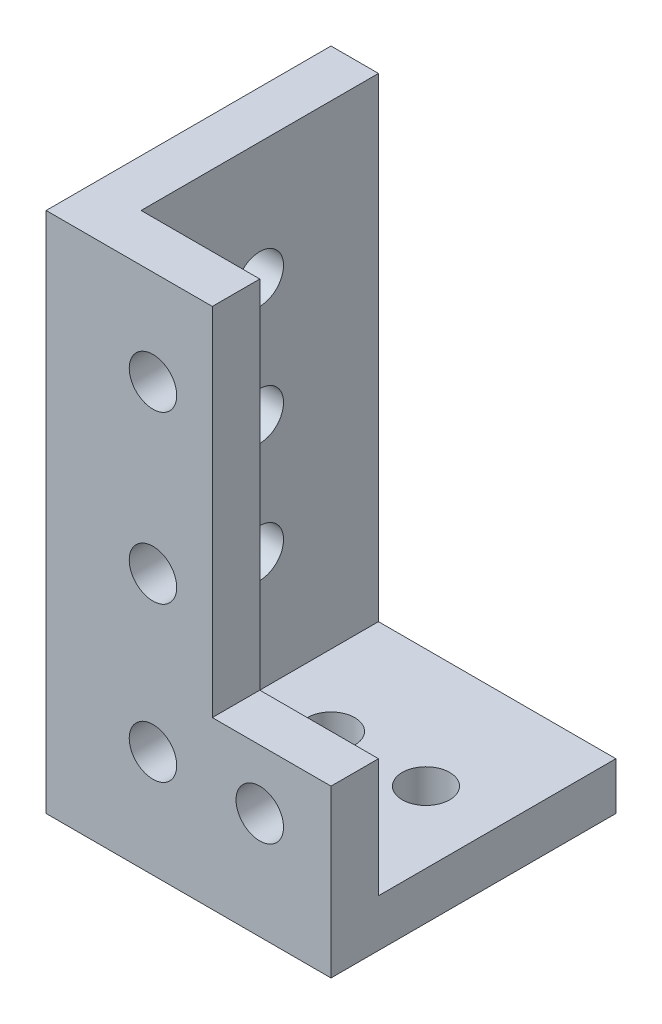
ISO-10303-21;
HEADER;
FILE_DESCRIPTION(('STEP AP214'),'2;1');
FILE_NAME('part.step','',(''),(''),'','','');
FILE_SCHEMA(('AUTOMOTIVE_DESIGN { 1 0 10303 214 1 1 1 1 }'));
ENDSEC;
DATA;
#1=APPLICATION_CONTEXT('core data for automotive mechanical design processes');
#2=APPLICATION_PROTOCOL_DEFINITION('international standard','automotive_design',2000,#1);
#3=PRODUCT_CONTEXT('',#1,'mechanical');
#4=PRODUCT('Part','Part','',(#3));
#5=PRODUCT_RELATED_PRODUCT_CATEGORY('part','',(#4));
#6=PRODUCT_DEFINITION_FORMATION('','',#4);
#7=PRODUCT_DEFINITION_CONTEXT('part definition',#1,'design');
#8=PRODUCT_DEFINITION('design','',#6,#7);
#9=PRODUCT_DEFINITION_SHAPE('','',#8);
#10=(LENGTH_UNIT() NAMED_UNIT(*) SI_UNIT(.MILLI.,.METRE.));
#11=(NAMED_UNIT(*) PLANE_ANGLE_UNIT() SI_UNIT($,.RADIAN.));
#12=(NAMED_UNIT(*) SI_UNIT($,.STERADIAN.) SOLID_ANGLE_UNIT());
#13=UNCERTAINTY_MEASURE_WITH_UNIT(LENGTH_MEASURE(1.E-05),#10,'distance_accuracy_value','');
#14=(GEOMETRIC_REPRESENTATION_CONTEXT(3) GLOBAL_UNCERTAINTY_ASSIGNED_CONTEXT((#13)) GLOBAL_UNIT_ASSIGNED_CONTEXT((#10,
#11,#12)) REPRESENTATION_CONTEXT('',''));
#15=CARTESIAN_POINT('',(0.,0.,0.));
#16=DIRECTION('',(0.,0.,1.));
#17=DIRECTION('',(1.,0.,0.));
#18=AXIS2_PLACEMENT_3D('',#15,#16,#17);
#19=CARTESIAN_POINT('',(0.,0.,50.));
#20=DIRECTION('',(1.,0.,0.));
#21=DIRECTION('',(0.,0.,-1.));
#22=AXIS2_PLACEMENT_3D('',#19,#20,#21);
#23=PLANE('',#22);
#24=CARTESIAN_POINT('',(0.,35.,25.));
#25=DIRECTION('',(1.,0.,0.));
#26=DIRECTION('',(0.,0.,-1.));
#27=AXIS2_PLACEMENT_3D('',#24,#25,#26);
#28=CIRCLE('',#27,5.);
#29=CARTESIAN_POINT('',(0.,35.,20.));
#30=VERTEX_POINT('',#29);
#31=EDGE_CURVE('E235',#30,#30,#28,.T.);
#32=ORIENTED_EDGE('',*,*,#31,.T.);
#33=EDGE_LOOP('',(#32));
#34=FACE_BOUND('',#33,.T.);
#35=CARTESIAN_POINT('',(0.,85.,25.));
#36=DIRECTION('',(1.,0.,0.));
#37=DIRECTION('',(0.,0.,-1.));
#38=AXIS2_PLACEMENT_3D('',#35,#36,#37);
#39=CIRCLE('',#38,5.);
#40=CARTESIAN_POINT('',(0.,85.,20.));
#41=VERTEX_POINT('',#40);
#42=EDGE_CURVE('E239',#41,#41,#39,.T.);
#43=ORIENTED_EDGE('',*,*,#42,.T.);
#44=EDGE_LOOP('',(#43));
#45=FACE_BOUND('',#44,.T.);
#46=CARTESIAN_POINT('',(0.,60.,25.));
#47=DIRECTION('',(1.,0.,0.));
#48=DIRECTION('',(0.,0.,-1.));
#49=AXIS2_PLACEMENT_3D('',#46,#47,#48);
#50=CIRCLE('',#49,5.);
#51=CARTESIAN_POINT('',(0.,60.,20.));
#52=VERTEX_POINT('',#51);
#53=EDGE_CURVE('E179',#52,#52,#50,.T.);
#54=ORIENTED_EDGE('',*,*,#53,.T.);
#55=EDGE_LOOP('',(#54));
#56=FACE_BOUND('',#55,.T.);
#57=DIRECTION('',(0.,-1.,0.));
#58=VECTOR('',#57,1.);
#59=CARTESIAN_POINT('',(0.,0.,0.));
#60=LINE('',#59,#58);
#61=CARTESIAN_POINT('',(0.,110.,0.));
#62=VERTEX_POINT('',#61);
#63=CARTESIAN_POINT('',(0.,0.,0.));
#64=VERTEX_POINT('',#63);
#65=EDGE_CURVE('E96',#62,#64,#60,.T.);
#66=ORIENTED_EDGE('',*,*,#65,.T.);
#67=DIRECTION('',(0.,0.,-1.));
#68=VECTOR('',#67,1.);
#69=CARTESIAN_POINT('',(0.,0.,50.));
#70=LINE('',#69,#68);
#71=CARTESIAN_POINT('',(0.,0.,60.));
#72=VERTEX_POINT('',#71);
#73=EDGE_CURVE('E11',#72,#64,#70,.T.);
#74=ORIENTED_EDGE('',*,*,#73,.F.);
#75=DIRECTION('',(0.,-1.,0.));
#76=VECTOR('',#75,1.);
#77=CARTESIAN_POINT('',(0.,0.,60.));
#78=LINE('',#77,#76);
#79=CARTESIAN_POINT('',(0.,110.,60.));
#80=VERTEX_POINT('',#79);
#81=EDGE_CURVE('E98',#80,#72,#78,.T.);
#82=ORIENTED_EDGE('',*,*,#81,.F.);
#83=DIRECTION('',(0.,0.,-1.));
#84=VECTOR('',#83,1.);
#85=CARTESIAN_POINT('',(0.,110.,50.));
#86=LINE('',#85,#84);
#87=EDGE_CURVE('E84',#80,#62,#86,.T.);
#88=ORIENTED_EDGE('',*,*,#87,.T.);
#89=EDGE_LOOP('',(#66,#74,#82,#88));
#90=FACE_BOUND('',#89,.T.);
#91=ADVANCED_FACE('F33',(#34,#45,#56,#90),#23,.F.);
#92=CARTESIAN_POINT('',(0.,0.,50.));
#93=DIRECTION('',(0.,1.,0.));
#94=DIRECTION('',(0.,0.,1.));
#95=AXIS2_PLACEMENT_3D('',#92,#93,#94);
#96=PLANE('',#95);
#97=CARTESIAN_POINT('',(25.,0.,25.));
#98=DIRECTION('',(0.,1.,0.));
#99=DIRECTION('',(0.,0.,1.));
#100=AXIS2_PLACEMENT_3D('',#97,#98,#99);
#101=CIRCLE('',#100,5.);
#102=CARTESIAN_POINT('',(25.,0.,30.));
#103=VERTEX_POINT('',#102);
#104=EDGE_CURVE('E259',#103,#103,#101,.T.);
#105=ORIENTED_EDGE('',*,*,#104,.T.);
#106=EDGE_LOOP('',(#105));
#107=FACE_BOUND('',#106,.T.);
#108=CARTESIAN_POINT('',(45.,0.,25.));
#109=DIRECTION('',(0.,1.,0.));
#110=DIRECTION('',(0.,0.,1.));
#111=AXIS2_PLACEMENT_3D('',#108,#109,#110);
#112=CIRCLE('',#111,5.);
#113=CARTESIAN_POINT('',(45.,0.,30.));
#114=VERTEX_POINT('',#113);
#115=EDGE_CURVE('E254',#114,#114,#112,.T.);
#116=ORIENTED_EDGE('',*,*,#115,.T.);
#117=EDGE_LOOP('',(#116));
#118=FACE_BOUND('',#117,.T.);
#119=DIRECTION('',(1.,0.,0.));
#120=VECTOR('',#119,1.);
#121=CARTESIAN_POINT('',(0.,0.,0.));
#122=LINE('',#121,#120);
#123=CARTESIAN_POINT('',(60.,0.,0.));
#124=VERTEX_POINT('',#123);
#125=EDGE_CURVE('E103',#64,#124,#122,.T.);
#126=ORIENTED_EDGE('',*,*,#125,.T.);
#127=DIRECTION('',(0.,0.,-1.));
#128=VECTOR('',#127,1.);
#129=CARTESIAN_POINT('',(60.,0.,50.));
#130=LINE('',#129,#128);
#131=CARTESIAN_POINT('',(60.,0.,60.));
#132=VERTEX_POINT('',#131);
#133=EDGE_CURVE('E42',#132,#124,#130,.T.);
#134=ORIENTED_EDGE('',*,*,#133,.F.);
#135=DIRECTION('',(1.,0.,0.));
#136=VECTOR('',#135,1.);
#137=CARTESIAN_POINT('',(60.,0.,60.));
#138=LINE('',#137,#136);
#139=EDGE_CURVE('E154',#72,#132,#138,.T.);
#140=ORIENTED_EDGE('',*,*,#139,.F.);
#141=ORIENTED_EDGE('',*,*,#73,.T.);
#142=EDGE_LOOP('',(#126,#134,#140,#141));
#143=FACE_BOUND('',#142,.T.);
#144=ADVANCED_FACE('F152',(#107,#118,#143),#96,.F.);
#145=CARTESIAN_POINT('',(60.,10.,50.));
#146=DIRECTION('',(-1.,0.,0.));
#147=DIRECTION('',(0.,0.,1.));
#148=AXIS2_PLACEMENT_3D('',#145,#146,#147);
#149=PLANE('',#148);
#150=DIRECTION('',(0.,1.,0.));
#151=VECTOR('',#150,1.);
#152=CARTESIAN_POINT('',(60.,10.,0.));
#153=LINE('',#152,#151);
#154=CARTESIAN_POINT('',(60.,10.,0.));
#155=VERTEX_POINT('',#154);
#156=EDGE_CURVE('E106',#124,#155,#153,.T.);
#157=ORIENTED_EDGE('',*,*,#156,.T.);
#158=DIRECTION('',(0.,0.,-1.));
#159=VECTOR('',#158,1.);
#160=CARTESIAN_POINT('',(60.,10.,50.));
#161=LINE('',#160,#159);
#162=CARTESIAN_POINT('',(60.,10.,50.));
#163=VERTEX_POINT('',#162);
#164=EDGE_CURVE('E120',#163,#155,#161,.T.);
#165=ORIENTED_EDGE('',*,*,#164,.F.);
#166=DIRECTION('',(0.,1.,0.));
#167=VECTOR('',#166,1.);
#168=CARTESIAN_POINT('',(60.,35.,50.));
#169=LINE('',#168,#167);
#170=CARTESIAN_POINT('',(60.,35.,50.));
#171=VERTEX_POINT('',#170);
#172=EDGE_CURVE('E138',#163,#171,#169,.T.);
#173=ORIENTED_EDGE('',*,*,#172,.T.);
#174=DIRECTION('',(0.,0.,-1.));
#175=VECTOR('',#174,1.);
#176=CARTESIAN_POINT('',(60.,35.,60.));
#177=LINE('',#176,#175);
#178=CARTESIAN_POINT('',(60.,35.,60.));
#179=VERTEX_POINT('',#178);
#180=EDGE_CURVE('E104',#179,#171,#177,.T.);
#181=ORIENTED_EDGE('',*,*,#180,.F.);
#182=DIRECTION('',(0.,1.,0.));
#183=VECTOR('',#182,1.);
#184=CARTESIAN_POINT('',(60.,35.,60.));
#185=LINE('',#184,#183);
#186=EDGE_CURVE('E148',#132,#179,#185,.T.);
#187=ORIENTED_EDGE('',*,*,#186,.F.);
#188=ORIENTED_EDGE('',*,*,#133,.T.);
#189=EDGE_LOOP('',(#157,#165,#173,#181,#187,#188));
#190=FACE_BOUND('',#189,.T.);
#191=ADVANCED_FACE('F142',(#190),#149,.F.);
#192=CARTESIAN_POINT('',(10.,10.,50.));
#193=DIRECTION('',(0.,-1.,0.));
#194=DIRECTION('',(0.,0.,-1.));
#195=AXIS2_PLACEMENT_3D('',#192,#193,#194);
#196=PLANE('',#195);
#197=CARTESIAN_POINT('',(25.,10.,25.));
#198=DIRECTION('',(0.,1.,0.));
#199=DIRECTION('',(0.,0.,1.));
#200=AXIS2_PLACEMENT_3D('',#197,#198,#199);
#201=CIRCLE('',#200,5.);
#202=CARTESIAN_POINT('',(25.,10.,30.));
#203=VERTEX_POINT('',#202);
#204=EDGE_CURVE('E262',#203,#203,#201,.T.);
#205=ORIENTED_EDGE('',*,*,#204,.F.);
#206=EDGE_LOOP('',(#205));
#207=FACE_BOUND('',#206,.T.);
#208=CARTESIAN_POINT('',(45.,10.,25.));
#209=DIRECTION('',(0.,1.,0.));
#210=DIRECTION('',(0.,0.,1.));
#211=AXIS2_PLACEMENT_3D('',#208,#209,#210);
#212=CIRCLE('',#211,5.);
#213=CARTESIAN_POINT('',(45.,10.,30.));
#214=VERTEX_POINT('',#213);
#215=EDGE_CURVE('E256',#214,#214,#212,.T.);
#216=ORIENTED_EDGE('',*,*,#215,.F.);
#217=EDGE_LOOP('',(#216));
#218=FACE_BOUND('',#217,.T.);
#219=DIRECTION('',(-1.,0.,0.));
#220=VECTOR('',#219,1.);
#221=CARTESIAN_POINT('',(10.,10.,0.));
#222=LINE('',#221,#220);
#223=CARTESIAN_POINT('',(10.,10.,0.));
#224=VERTEX_POINT('',#223);
#225=EDGE_CURVE('E116',#155,#224,#222,.T.);
#226=ORIENTED_EDGE('',*,*,#225,.T.);
#227=DIRECTION('',(0.,0.,-1.));
#228=VECTOR('',#227,1.);
#229=CARTESIAN_POINT('',(10.,10.,50.));
#230=LINE('',#229,#228);
#231=CARTESIAN_POINT('',(10.,10.,50.));
#232=VERTEX_POINT('',#231);
#233=EDGE_CURVE('E51',#232,#224,#230,.T.);
#234=ORIENTED_EDGE('',*,*,#233,.F.);
#235=DIRECTION('',(-1.,0.,0.));
#236=VECTOR('',#235,1.);
#237=CARTESIAN_POINT('',(10.,10.,50.));
#238=LINE('',#237,#236);
#239=EDGE_CURVE('E90',#163,#232,#238,.T.);
#240=ORIENTED_EDGE('',*,*,#239,.F.);
#241=ORIENTED_EDGE('',*,*,#164,.T.);
#242=EDGE_LOOP('',(#226,#234,#240,#241));
#243=FACE_BOUND('',#242,.T.);
#244=ADVANCED_FACE('F139',(#207,#218,#243),#196,.F.);
#245=CARTESIAN_POINT('',(10.,110.,50.));
#246=DIRECTION('',(-1.,0.,0.));
#247=DIRECTION('',(0.,0.,1.));
#248=AXIS2_PLACEMENT_3D('',#245,#246,#247);
#249=PLANE('',#248);
#250=CARTESIAN_POINT('',(10.,35.,25.));
#251=DIRECTION('',(1.,0.,0.));
#252=DIRECTION('',(0.,0.,-1.));
#253=AXIS2_PLACEMENT_3D('',#250,#251,#252);
#254=CIRCLE('',#253,5.);
#255=CARTESIAN_POINT('',(10.,35.,20.));
#256=VERTEX_POINT('',#255);
#257=EDGE_CURVE('E251',#256,#256,#254,.T.);
#258=ORIENTED_EDGE('',*,*,#257,.F.);
#259=EDGE_LOOP('',(#258));
#260=FACE_BOUND('',#259,.T.);
#261=CARTESIAN_POINT('',(10.,85.,25.));
#262=DIRECTION('',(1.,0.,0.));
#263=DIRECTION('',(0.,0.,-1.));
#264=AXIS2_PLACEMENT_3D('',#261,#262,#263);
#265=CIRCLE('',#264,5.);
#266=CARTESIAN_POINT('',(10.,85.,20.));
#267=VERTEX_POINT('',#266);
#268=EDGE_CURVE('E247',#267,#267,#265,.T.);
#269=ORIENTED_EDGE('',*,*,#268,.F.);
#270=EDGE_LOOP('',(#269));
#271=FACE_BOUND('',#270,.T.);
#272=CARTESIAN_POINT('',(10.,60.,25.));
#273=DIRECTION('',(1.,0.,0.));
#274=DIRECTION('',(0.,0.,-1.));
#275=AXIS2_PLACEMENT_3D('',#272,#273,#274);
#276=CIRCLE('',#275,5.);
#277=CARTESIAN_POINT('',(10.,60.,20.));
#278=VERTEX_POINT('',#277);
#279=EDGE_CURVE('E243',#278,#278,#276,.T.);
#280=ORIENTED_EDGE('',*,*,#279,.F.);
#281=EDGE_LOOP('',(#280));
#282=FACE_BOUND('',#281,.T.);
#283=DIRECTION('',(0.,1.,0.));
#284=VECTOR('',#283,1.);
#285=CARTESIAN_POINT('',(10.,110.,0.));
#286=LINE('',#285,#284);
#287=CARTESIAN_POINT('',(10.,110.,0.));
#288=VERTEX_POINT('',#287);
#289=EDGE_CURVE('E73',#224,#288,#286,.T.);
#290=ORIENTED_EDGE('',*,*,#289,.T.);
#291=DIRECTION('',(0.,0.,-1.));
#292=VECTOR('',#291,1.);
#293=CARTESIAN_POINT('',(10.,110.,50.));
#294=LINE('',#293,#292);
#295=CARTESIAN_POINT('',(10.,110.,50.));
#296=VERTEX_POINT('',#295);
#297=EDGE_CURVE('E87',#296,#288,#294,.T.);
#298=ORIENTED_EDGE('',*,*,#297,.F.);
#299=DIRECTION('',(0.,1.,0.));
#300=VECTOR('',#299,1.);
#301=CARTESIAN_POINT('',(10.,110.,50.));
#302=LINE('',#301,#300);
#303=EDGE_CURVE('E99',#232,#296,#302,.T.);
#304=ORIENTED_EDGE('',*,*,#303,.F.);
#305=ORIENTED_EDGE('',*,*,#233,.T.);
#306=EDGE_LOOP('',(#290,#298,#304,#305));
#307=FACE_BOUND('',#306,.T.);
#308=ADVANCED_FACE('F211',(#260,#271,#282,#307),#249,.F.);
#309=CARTESIAN_POINT('',(0.,110.,50.));
#310=DIRECTION('',(0.,-1.,0.));
#311=DIRECTION('',(1.,0.,0.));
#312=AXIS2_PLACEMENT_3D('',#309,#310,#311);
#313=PLANE('',#312);
#314=DIRECTION('',(-1.,0.,0.));
#315=VECTOR('',#314,1.);
#316=CARTESIAN_POINT('',(0.,110.,0.));
#317=LINE('',#316,#315);
#318=EDGE_CURVE('E79',#288,#62,#317,.T.);
#319=ORIENTED_EDGE('',*,*,#318,.T.);
#320=ORIENTED_EDGE('',*,*,#87,.F.);
#321=DIRECTION('',(-1.,0.,0.));
#322=VECTOR('',#321,1.);
#323=CARTESIAN_POINT('',(0.,110.,60.));
#324=LINE('',#323,#322);
#325=CARTESIAN_POINT('',(35.,110.,60.));
#326=VERTEX_POINT('',#325);
#327=EDGE_CURVE('E171',#326,#80,#324,.T.);
#328=ORIENTED_EDGE('',*,*,#327,.F.);
#329=DIRECTION('',(0.,0.,-1.));
#330=VECTOR('',#329,1.);
#331=CARTESIAN_POINT('',(35.,110.,60.));
#332=LINE('',#331,#330);
#333=CARTESIAN_POINT('',(35.,110.,50.));
#334=VERTEX_POINT('',#333);
#335=EDGE_CURVE('E173',#326,#334,#332,.T.);
#336=ORIENTED_EDGE('',*,*,#335,.T.);
#337=DIRECTION('',(-1.,0.,0.));
#338=VECTOR('',#337,1.);
#339=CARTESIAN_POINT('',(0.,110.,50.));
#340=LINE('',#339,#338);
#341=EDGE_CURVE('E163',#334,#296,#340,.T.);
#342=ORIENTED_EDGE('',*,*,#341,.T.);
#343=ORIENTED_EDGE('',*,*,#297,.T.);
#344=EDGE_LOOP('',(#319,#320,#328,#336,#342,#343));
#345=FACE_BOUND('',#344,.T.);
#346=ADVANCED_FACE('F81',(#345),#313,.F.);
#347=CARTESIAN_POINT('',(0.,0.,0.));
#348=DIRECTION('',(0.,0.,-1.));
#349=DIRECTION('',(-1.,0.,0.));
#350=AXIS2_PLACEMENT_3D('',#347,#348,#349);
#351=PLANE('',#350);
#352=ORIENTED_EDGE('',*,*,#65,.F.);
#353=ORIENTED_EDGE('',*,*,#318,.F.);
#354=ORIENTED_EDGE('',*,*,#289,.F.);
#355=ORIENTED_EDGE('',*,*,#225,.F.);
#356=ORIENTED_EDGE('',*,*,#156,.F.);
#357=ORIENTED_EDGE('',*,*,#125,.F.);
#358=EDGE_LOOP('',(#352,#353,#354,#355,#356,#357));
#359=FACE_BOUND('',#358,.T.);
#360=ADVANCED_FACE('F101',(#359),#351,.T.);
#361=CARTESIAN_POINT('',(35.,35.,60.));
#362=DIRECTION('',(0.,-1.,0.));
#363=DIRECTION('',(0.,0.,-1.));
#364=AXIS2_PLACEMENT_3D('',#361,#362,#363);
#365=PLANE('',#364);
#366=DIRECTION('',(-1.,0.,0.));
#367=VECTOR('',#366,1.);
#368=CARTESIAN_POINT('',(35.,35.,50.));
#369=LINE('',#368,#367);
#370=CARTESIAN_POINT('',(35.,35.,50.));
#371=VERTEX_POINT('',#370);
#372=EDGE_CURVE('E176',#171,#371,#369,.T.);
#373=ORIENTED_EDGE('',*,*,#372,.T.);
#374=DIRECTION('',(0.,0.,-1.));
#375=VECTOR('',#374,1.);
#376=CARTESIAN_POINT('',(35.,35.,60.));
#377=LINE('',#376,#375);
#378=CARTESIAN_POINT('',(35.,35.,60.));
#379=VERTEX_POINT('',#378);
#380=EDGE_CURVE('E109',#379,#371,#377,.T.);
#381=ORIENTED_EDGE('',*,*,#380,.F.);
#382=DIRECTION('',(-1.,0.,0.));
#383=VECTOR('',#382,1.);
#384=CARTESIAN_POINT('',(35.,35.,60.));
#385=LINE('',#384,#383);
#386=EDGE_CURVE('E161',#179,#379,#385,.T.);
#387=ORIENTED_EDGE('',*,*,#386,.F.);
#388=ORIENTED_EDGE('',*,*,#180,.T.);
#389=EDGE_LOOP('',(#373,#381,#387,#388));
#390=FACE_BOUND('',#389,.T.);
#391=ADVANCED_FACE('F202',(#390),#365,.F.);
#392=CARTESIAN_POINT('',(35.,110.,60.));
#393=DIRECTION('',(-1.,0.,0.));
#394=DIRECTION('',(0.,-1.,0.));
#395=AXIS2_PLACEMENT_3D('',#392,#393,#394);
#396=PLANE('',#395);
#397=DIRECTION('',(0.,1.,0.));
#398=VECTOR('',#397,1.);
#399=CARTESIAN_POINT('',(35.,110.,50.));
#400=LINE('',#399,#398);
#401=EDGE_CURVE('E181',#371,#334,#400,.T.);
#402=ORIENTED_EDGE('',*,*,#401,.T.);
#403=ORIENTED_EDGE('',*,*,#335,.F.);
#404=DIRECTION('',(0.,1.,0.));
#405=VECTOR('',#404,1.);
#406=CARTESIAN_POINT('',(35.,110.,60.));
#407=LINE('',#406,#405);
#408=EDGE_CURVE('E168',#379,#326,#407,.T.);
#409=ORIENTED_EDGE('',*,*,#408,.F.);
#410=ORIENTED_EDGE('',*,*,#380,.T.);
#411=EDGE_LOOP('',(#402,#403,#409,#410));
#412=FACE_BOUND('',#411,.T.);
#413=ADVANCED_FACE('F193',(#412),#396,.F.);
#414=CARTESIAN_POINT('',(0.,0.,60.));
#415=DIRECTION('',(0.,0.,-1.));
#416=DIRECTION('',(-1.,0.,0.));
#417=AXIS2_PLACEMENT_3D('',#414,#415,#416);
#418=PLANE('',#417);
#419=CARTESIAN_POINT('',(45.,22.5,60.));
#420=DIRECTION('',(0.,0.,-1.));
#421=DIRECTION('',(-1.,0.,0.));
#422=AXIS2_PLACEMENT_3D('',#419,#420,#421);
#423=CIRCLE('',#422,5.);
#424=CARTESIAN_POINT('',(40.,22.5,60.));
#425=VERTEX_POINT('',#424);
#426=EDGE_CURVE('E283',#425,#425,#423,.T.);
#427=ORIENTED_EDGE('',*,*,#426,.T.);
#428=EDGE_LOOP('',(#427));
#429=FACE_BOUND('',#428,.T.);
#430=CARTESIAN_POINT('',(22.5,90.,60.));
#431=DIRECTION('',(0.,0.,-1.));
#432=DIRECTION('',(-1.,0.,0.));
#433=AXIS2_PLACEMENT_3D('',#430,#431,#432);
#434=CIRCLE('',#433,5.);
#435=CARTESIAN_POINT('',(17.5,90.,60.));
#436=VERTEX_POINT('',#435);
#437=EDGE_CURVE('E277',#436,#436,#434,.T.);
#438=ORIENTED_EDGE('',*,*,#437,.T.);
#439=EDGE_LOOP('',(#438));
#440=FACE_BOUND('',#439,.T.);
#441=CARTESIAN_POINT('',(22.5,55.,60.));
#442=DIRECTION('',(0.,0.,-1.));
#443=DIRECTION('',(-1.,0.,0.));
#444=AXIS2_PLACEMENT_3D('',#441,#442,#443);
#445=CIRCLE('',#444,5.);
#446=CARTESIAN_POINT('',(17.5,55.,60.));
#447=VERTEX_POINT('',#446);
#448=EDGE_CURVE('E271',#447,#447,#445,.T.);
#449=ORIENTED_EDGE('',*,*,#448,.T.);
#450=EDGE_LOOP('',(#449));
#451=FACE_BOUND('',#450,.T.);
#452=CARTESIAN_POINT('',(22.5,22.5,60.));
#453=DIRECTION('',(0.,0.,-1.));
#454=DIRECTION('',(-1.,0.,0.));
#455=AXIS2_PLACEMENT_3D('',#452,#453,#454);
#456=CIRCLE('',#455,5.);
#457=CARTESIAN_POINT('',(17.5,22.5,60.));
#458=VERTEX_POINT('',#457);
#459=EDGE_CURVE('E265',#458,#458,#456,.T.);
#460=ORIENTED_EDGE('',*,*,#459,.T.);
#461=EDGE_LOOP('',(#460));
#462=FACE_BOUND('',#461,.T.);
#463=ORIENTED_EDGE('',*,*,#81,.T.);
#464=ORIENTED_EDGE('',*,*,#139,.T.);
#465=ORIENTED_EDGE('',*,*,#186,.T.);
#466=ORIENTED_EDGE('',*,*,#386,.T.);
#467=ORIENTED_EDGE('',*,*,#408,.T.);
#468=ORIENTED_EDGE('',*,*,#327,.T.);
#469=EDGE_LOOP('',(#463,#464,#465,#466,#467,#468));
#470=FACE_BOUND('',#469,.T.);
#471=ADVANCED_FACE('F158',(#429,#440,#451,#462,#470),#418,.F.);
#472=CARTESIAN_POINT('',(0.,0.,50.));
#473=DIRECTION('',(0.,0.,-1.));
#474=DIRECTION('',(-1.,0.,0.));
#475=AXIS2_PLACEMENT_3D('',#472,#473,#474);
#476=PLANE('',#475);
#477=CARTESIAN_POINT('',(45.,22.5,50.));
#478=DIRECTION('',(0.,0.,-1.));
#479=DIRECTION('',(-1.,0.,0.));
#480=AXIS2_PLACEMENT_3D('',#477,#478,#479);
#481=CIRCLE('',#480,5.);
#482=CARTESIAN_POINT('',(40.,22.5,50.));
#483=VERTEX_POINT('',#482);
#484=EDGE_CURVE('E286',#483,#483,#481,.T.);
#485=ORIENTED_EDGE('',*,*,#484,.F.);
#486=EDGE_LOOP('',(#485));
#487=FACE_BOUND('',#486,.T.);
#488=CARTESIAN_POINT('',(22.5,90.,50.));
#489=DIRECTION('',(0.,0.,-1.));
#490=DIRECTION('',(-1.,0.,0.));
#491=AXIS2_PLACEMENT_3D('',#488,#489,#490);
#492=CIRCLE('',#491,5.);
#493=CARTESIAN_POINT('',(17.5,90.,50.));
#494=VERTEX_POINT('',#493);
#495=EDGE_CURVE('E280',#494,#494,#492,.T.);
#496=ORIENTED_EDGE('',*,*,#495,.F.);
#497=EDGE_LOOP('',(#496));
#498=FACE_BOUND('',#497,.T.);
#499=CARTESIAN_POINT('',(22.5,55.,50.));
#500=DIRECTION('',(0.,0.,-1.));
#501=DIRECTION('',(-1.,0.,0.));
#502=AXIS2_PLACEMENT_3D('',#499,#500,#501);
#503=CIRCLE('',#502,5.);
#504=CARTESIAN_POINT('',(17.5,55.,50.));
#505=VERTEX_POINT('',#504);
#506=EDGE_CURVE('E274',#505,#505,#503,.T.);
#507=ORIENTED_EDGE('',*,*,#506,.F.);
#508=EDGE_LOOP('',(#507));
#509=FACE_BOUND('',#508,.T.);
#510=CARTESIAN_POINT('',(22.5,22.5,50.));
#511=DIRECTION('',(0.,0.,-1.));
#512=DIRECTION('',(-1.,0.,0.));
#513=AXIS2_PLACEMENT_3D('',#510,#511,#512);
#514=CIRCLE('',#513,5.);
#515=CARTESIAN_POINT('',(17.5,22.5,50.));
#516=VERTEX_POINT('',#515);
#517=EDGE_CURVE('E268',#516,#516,#514,.T.);
#518=ORIENTED_EDGE('',*,*,#517,.F.);
#519=EDGE_LOOP('',(#518));
#520=FACE_BOUND('',#519,.T.);
#521=ORIENTED_EDGE('',*,*,#172,.F.);
#522=ORIENTED_EDGE('',*,*,#239,.T.);
#523=ORIENTED_EDGE('',*,*,#303,.T.);
#524=ORIENTED_EDGE('',*,*,#341,.F.);
#525=ORIENTED_EDGE('',*,*,#401,.F.);
#526=ORIENTED_EDGE('',*,*,#372,.F.);
#527=EDGE_LOOP('',(#521,#522,#523,#524,#525,#526));
#528=FACE_BOUND('',#527,.T.);
#529=ADVANCED_FACE('F134',(#487,#498,#509,#520,#528),#476,.T.);
#530=CARTESIAN_POINT('',(0.,60.,25.));
#531=DIRECTION('',(1.,0.,0.));
#532=DIRECTION('',(0.,0.,-1.));
#533=AXIS2_PLACEMENT_3D('',#530,#531,#532);
#534=CYLINDRICAL_SURFACE('',#533,5.);
#535=ORIENTED_EDGE('',*,*,#53,.F.);
#536=EDGE_LOOP('',(#535));
#537=FACE_BOUND('',#536,.T.);
#538=ORIENTED_EDGE('',*,*,#279,.T.);
#539=EDGE_LOOP('',(#538));
#540=FACE_BOUND('',#539,.T.);
#541=ADVANCED_FACE('F303',(#537,#540),#534,.F.);
#542=CARTESIAN_POINT('',(0.,85.,25.));
#543=DIRECTION('',(1.,0.,0.));
#544=DIRECTION('',(0.,0.,-1.));
#545=AXIS2_PLACEMENT_3D('',#542,#543,#544);
#546=CYLINDRICAL_SURFACE('',#545,5.);
#547=ORIENTED_EDGE('',*,*,#42,.F.);
#548=EDGE_LOOP('',(#547));
#549=FACE_BOUND('',#548,.T.);
#550=ORIENTED_EDGE('',*,*,#268,.T.);
#551=EDGE_LOOP('',(#550));
#552=FACE_BOUND('',#551,.T.);
#553=ADVANCED_FACE('F335',(#549,#552),#546,.F.);
#554=CARTESIAN_POINT('',(0.,35.,25.));
#555=DIRECTION('',(1.,0.,0.));
#556=DIRECTION('',(0.,0.,-1.));
#557=AXIS2_PLACEMENT_3D('',#554,#555,#556);
#558=CYLINDRICAL_SURFACE('',#557,5.);
#559=ORIENTED_EDGE('',*,*,#31,.F.);
#560=EDGE_LOOP('',(#559));
#561=FACE_BOUND('',#560,.T.);
#562=ORIENTED_EDGE('',*,*,#257,.T.);
#563=EDGE_LOOP('',(#562));
#564=FACE_BOUND('',#563,.T.);
#565=ADVANCED_FACE('F331',(#561,#564),#558,.F.);
#566=CARTESIAN_POINT('',(45.,0.,25.));
#567=DIRECTION('',(0.,1.,0.));
#568=DIRECTION('',(0.,0.,1.));
#569=AXIS2_PLACEMENT_3D('',#566,#567,#568);
#570=CYLINDRICAL_SURFACE('',#569,5.);
#571=ORIENTED_EDGE('',*,*,#115,.F.);
#572=EDGE_LOOP('',(#571));
#573=FACE_BOUND('',#572,.T.);
#574=ORIENTED_EDGE('',*,*,#215,.T.);
#575=EDGE_LOOP('',(#574));
#576=FACE_BOUND('',#575,.T.);
#577=ADVANCED_FACE('F323',(#573,#576),#570,.F.);
#578=CARTESIAN_POINT('',(25.,0.,25.));
#579=DIRECTION('',(0.,1.,0.));
#580=DIRECTION('',(0.,0.,1.));
#581=AXIS2_PLACEMENT_3D('',#578,#579,#580);
#582=CYLINDRICAL_SURFACE('',#581,5.);
#583=ORIENTED_EDGE('',*,*,#104,.F.);
#584=EDGE_LOOP('',(#583));
#585=FACE_BOUND('',#584,.T.);
#586=ORIENTED_EDGE('',*,*,#204,.T.);
#587=EDGE_LOOP('',(#586));
#588=FACE_BOUND('',#587,.T.);
#589=ADVANCED_FACE('F314',(#585,#588),#582,.F.);
#590=CARTESIAN_POINT('',(22.5,22.5,60.));
#591=DIRECTION('',(0.,0.,-1.));
#592=DIRECTION('',(-1.,0.,0.));
#593=AXIS2_PLACEMENT_3D('',#590,#591,#592);
#594=CYLINDRICAL_SURFACE('',#593,5.);
#595=ORIENTED_EDGE('',*,*,#459,.F.);
#596=EDGE_LOOP('',(#595));
#597=FACE_BOUND('',#596,.T.);
#598=ORIENTED_EDGE('',*,*,#517,.T.);
#599=EDGE_LOOP('',(#598));
#600=FACE_BOUND('',#599,.T.);
#601=ADVANCED_FACE('F311',(#597,#600),#594,.F.);
#602=CARTESIAN_POINT('',(22.5,55.,60.));
#603=DIRECTION('',(0.,0.,-1.));
#604=DIRECTION('',(-1.,0.,0.));
#605=AXIS2_PLACEMENT_3D('',#602,#603,#604);
#606=CYLINDRICAL_SURFACE('',#605,5.);
#607=ORIENTED_EDGE('',*,*,#448,.F.);
#608=EDGE_LOOP('',(#607));
#609=FACE_BOUND('',#608,.T.);
#610=ORIENTED_EDGE('',*,*,#506,.T.);
#611=EDGE_LOOP('',(#610));
#612=FACE_BOUND('',#611,.T.);
#613=ADVANCED_FACE('F313',(#609,#612),#606,.F.);
#614=CARTESIAN_POINT('',(22.5,90.,60.));
#615=DIRECTION('',(0.,0.,-1.));
#616=DIRECTION('',(-1.,0.,0.));
#617=AXIS2_PLACEMENT_3D('',#614,#615,#616);
#618=CYLINDRICAL_SURFACE('',#617,5.);
#619=ORIENTED_EDGE('',*,*,#437,.F.);
#620=EDGE_LOOP('',(#619));
#621=FACE_BOUND('',#620,.T.);
#622=ORIENTED_EDGE('',*,*,#495,.T.);
#623=EDGE_LOOP('',(#622));
#624=FACE_BOUND('',#623,.T.);
#625=ADVANCED_FACE('F297',(#621,#624),#618,.F.);
#626=CARTESIAN_POINT('',(45.,22.5,60.));
#627=DIRECTION('',(0.,0.,-1.));
#628=DIRECTION('',(-1.,0.,0.));
#629=AXIS2_PLACEMENT_3D('',#626,#627,#628);
#630=CYLINDRICAL_SURFACE('',#629,5.);
#631=ORIENTED_EDGE('',*,*,#426,.F.);
#632=EDGE_LOOP('',(#631));
#633=FACE_BOUND('',#632,.T.);
#634=ORIENTED_EDGE('',*,*,#484,.T.);
#635=EDGE_LOOP('',(#634));
#636=FACE_BOUND('',#635,.T.);
#637=ADVANCED_FACE('F294',(#633,#636),#630,.F.);
#638=CLOSED_SHELL('',(#91,#144,#191,#244,#308,#346,#360,#391,#413,#471,#529,#541,#553,#565,#577,
#589,#601,#613,#625,#637));
#639=MANIFOLD_SOLID_BREP('B2',#638);
#640=ADVANCED_BREP_SHAPE_REPRESENTATION('',(#18,#639),#14);
#641=SHAPE_DEFINITION_REPRESENTATION(#9,#640);
ENDSEC;
END-ISO-10303-21;
